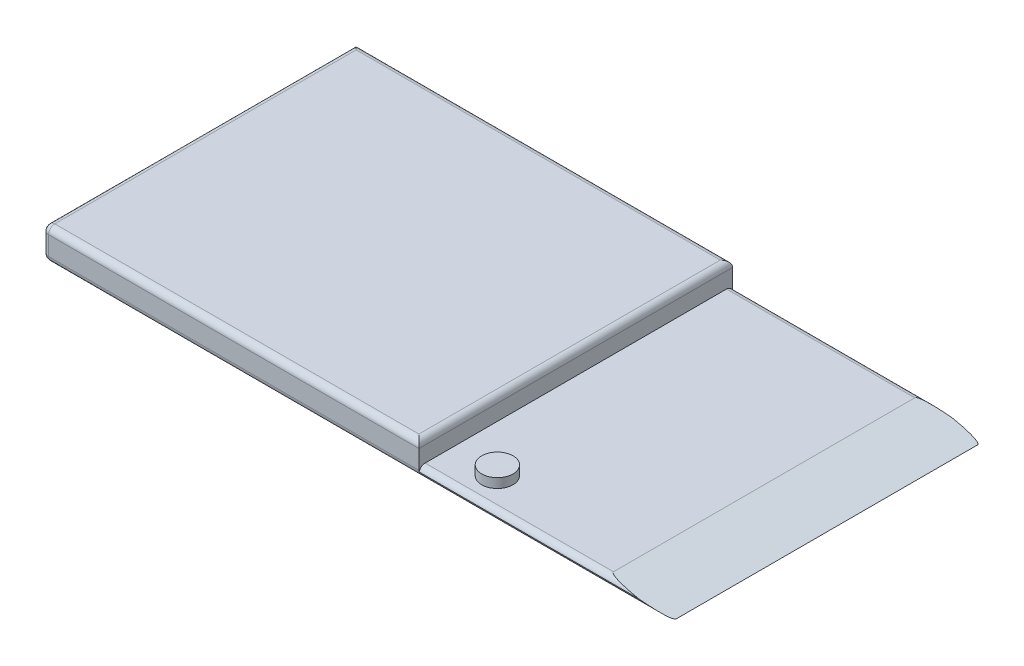
ISO-10303-21;
HEADER;
FILE_DESCRIPTION(('STEP AP214'),'2;1');
FILE_NAME('part.step','',(''),(''),'','','');
FILE_SCHEMA(('AUTOMOTIVE_DESIGN { 1 0 10303 214 1 1 1 1 }'));
ENDSEC;
DATA;
#1=APPLICATION_CONTEXT('core data for automotive mechanical design processes');
#2=APPLICATION_PROTOCOL_DEFINITION('international standard','automotive_design',2000,#1);
#3=PRODUCT_CONTEXT('',#1,'mechanical');
#4=PRODUCT('Part','Part','',(#3));
#5=PRODUCT_RELATED_PRODUCT_CATEGORY('part','',(#4));
#6=PRODUCT_DEFINITION_FORMATION('','',#4);
#7=PRODUCT_DEFINITION_CONTEXT('part definition',#1,'design');
#8=PRODUCT_DEFINITION('design','',#6,#7);
#9=PRODUCT_DEFINITION_SHAPE('','',#8);
#10=(LENGTH_UNIT() NAMED_UNIT(*) SI_UNIT(.MILLI.,.METRE.));
#11=(NAMED_UNIT(*) PLANE_ANGLE_UNIT() SI_UNIT($,.RADIAN.));
#12=(NAMED_UNIT(*) SI_UNIT($,.STERADIAN.) SOLID_ANGLE_UNIT());
#13=UNCERTAINTY_MEASURE_WITH_UNIT(LENGTH_MEASURE(1.E-05),#10,'distance_accuracy_value','');
#14=(GEOMETRIC_REPRESENTATION_CONTEXT(3) GLOBAL_UNCERTAINTY_ASSIGNED_CONTEXT((#13)) GLOBAL_UNIT_ASSIGNED_CONTEXT((#10,
#11,#12)) REPRESENTATION_CONTEXT('',''));
#15=CARTESIAN_POINT('',(0.,0.,0.));
#16=DIRECTION('',(0.,0.,1.));
#17=DIRECTION('',(1.,0.,0.));
#18=AXIS2_PLACEMENT_3D('',#15,#16,#17);
#19=CARTESIAN_POINT('',(-127.,12.7,-63.5));
#20=DIRECTION('',(0.,0.,1.));
#21=DIRECTION('',(1.,0.,0.));
#22=AXIS2_PLACEMENT_3D('',#19,#20,#21);
#23=PLANE('',#22);
#24=DIRECTION('',(0.,1.,0.));
#25=VECTOR('',#24,1.);
#26=CARTESIAN_POINT('',(25.4,12.7,-63.5));
#27=LINE('',#26,#25);
#28=CARTESIAN_POINT('',(25.4,2.54,-63.5));
#29=VERTEX_POINT('',#28);
#30=CARTESIAN_POINT('',(25.4,10.16,-63.5));
#31=VERTEX_POINT('',#30);
#32=EDGE_CURVE('E171',#29,#31,#27,.T.);
#33=ORIENTED_EDGE('',*,*,#32,.F.);
#34=DIRECTION('',(-1.,0.,0.));
#35=VECTOR('',#34,1.);
#36=CARTESIAN_POINT('',(-127.,2.54,-63.5));
#37=LINE('',#36,#35);
#38=CARTESIAN_POINT('',(-127.,2.54,-63.5));
#39=VERTEX_POINT('',#38);
#40=EDGE_CURVE('E279',#29,#39,#37,.T.);
#41=ORIENTED_EDGE('',*,*,#40,.T.);
#42=DIRECTION('',(0.,-1.,0.));
#43=VECTOR('',#42,1.);
#44=CARTESIAN_POINT('',(-127.,12.7,-63.5));
#45=LINE('',#44,#43);
#46=CARTESIAN_POINT('',(-127.,10.16,-63.5));
#47=VERTEX_POINT('',#46);
#48=EDGE_CURVE('E175',#47,#39,#45,.T.);
#49=ORIENTED_EDGE('',*,*,#48,.F.);
#50=DIRECTION('',(-1.,0.,0.));
#51=VECTOR('',#50,1.);
#52=CARTESIAN_POINT('',(25.4,10.16,-63.5));
#53=LINE('',#52,#51);
#54=EDGE_CURVE('E215',#47,#31,#53,.F.);
#55=ORIENTED_EDGE('',*,*,#54,.T.);
#56=EDGE_LOOP('',(#33,#41,#49,#55));
#57=FACE_BOUND('',#56,.T.);
#58=ADVANCED_FACE('F42',(#57),#23,.F.);
#59=CARTESIAN_POINT('',(-127.,12.7,63.5));
#60=DIRECTION('',(0.,0.,-1.));
#61=DIRECTION('',(-1.,0.,0.));
#62=AXIS2_PLACEMENT_3D('',#59,#60,#61);
#63=PLANE('',#62);
#64=DIRECTION('',(1.,0.,0.));
#65=VECTOR('',#64,1.);
#66=CARTESIAN_POINT('',(-127.,10.16,63.5));
#67=LINE('',#66,#65);
#68=CARTESIAN_POINT('',(25.4,10.16,63.5));
#69=VERTEX_POINT('',#68);
#70=CARTESIAN_POINT('',(-124.46,10.16,63.5));
#71=VERTEX_POINT('',#70);
#72=EDGE_CURVE('E155',#69,#71,#67,.F.);
#73=ORIENTED_EDGE('',*,*,#72,.T.);
#74=DIRECTION('',(0.,-1.,0.));
#75=VECTOR('',#74,1.);
#76=CARTESIAN_POINT('',(-124.46,12.7,63.5));
#77=LINE('',#76,#75);
#78=CARTESIAN_POINT('',(-124.46,2.54,63.5));
#79=VERTEX_POINT('',#78);
#80=EDGE_CURVE('E261',#71,#79,#77,.T.);
#81=ORIENTED_EDGE('',*,*,#80,.T.);
#82=DIRECTION('',(1.,0.,0.));
#83=VECTOR('',#82,1.);
#84=CARTESIAN_POINT('',(-127.,2.54,63.5));
#85=LINE('',#84,#83);
#86=CARTESIAN_POINT('',(25.4,2.54000000000001,63.5));
#87=VERTEX_POINT('',#86);
#88=EDGE_CURVE('E179',#79,#87,#85,.T.);
#89=ORIENTED_EDGE('',*,*,#88,.T.);
#90=DIRECTION('',(0.,1.,0.));
#91=VECTOR('',#90,1.);
#92=CARTESIAN_POINT('',(25.4,12.7,63.5));
#93=LINE('',#92,#91);
#94=EDGE_CURVE('E168',#87,#69,#93,.T.);
#95=ORIENTED_EDGE('',*,*,#94,.T.);
#96=EDGE_LOOP('',(#73,#81,#89,#95));
#97=FACE_BOUND('',#96,.T.);
#98=ADVANCED_FACE('F177',(#97),#63,.F.);
#99=CARTESIAN_POINT('',(0.,12.7,0.));
#100=DIRECTION('',(0.,1.,0.));
#101=DIRECTION('',(0.,0.,1.));
#102=AXIS2_PLACEMENT_3D('',#99,#100,#101);
#103=PLANE('',#102);
#104=DIRECTION('',(1.,0.,0.));
#105=VECTOR('',#104,1.);
#106=CARTESIAN_POINT('',(25.4,12.7,60.96));
#107=LINE('',#106,#105);
#108=CARTESIAN_POINT('',(-124.46,12.7,60.96));
#109=VERTEX_POINT('',#108);
#110=CARTESIAN_POINT('',(22.86,12.7,60.96));
#111=VERTEX_POINT('',#110);
#112=EDGE_CURVE('E174',#109,#111,#107,.T.);
#113=ORIENTED_EDGE('',*,*,#112,.T.);
#114=DIRECTION('',(0.,0.,1.));
#115=VECTOR('',#114,1.);
#116=CARTESIAN_POINT('',(22.86,12.7,0.));
#117=LINE('',#116,#115);
#118=CARTESIAN_POINT('',(22.86,12.7,-60.96));
#119=VERTEX_POINT('',#118);
#120=EDGE_CURVE('E146',#111,#119,#117,.F.);
#121=ORIENTED_EDGE('',*,*,#120,.T.);
#122=DIRECTION('',(-1.,0.,0.));
#123=VECTOR('',#122,1.);
#124=CARTESIAN_POINT('',(-127.,12.7,-60.96));
#125=LINE('',#124,#123);
#126=CARTESIAN_POINT('',(-124.46,12.7,-60.96));
#127=VERTEX_POINT('',#126);
#128=EDGE_CURVE('E210',#119,#127,#125,.T.);
#129=ORIENTED_EDGE('',*,*,#128,.T.);
#130=DIRECTION('',(0.,0.,1.));
#131=VECTOR('',#130,1.);
#132=CARTESIAN_POINT('',(-124.46,12.7,63.5));
#133=LINE('',#132,#131);
#134=EDGE_CURVE('E206',#127,#109,#133,.T.);
#135=ORIENTED_EDGE('',*,*,#134,.T.);
#136=EDGE_LOOP('',(#113,#121,#129,#135));
#137=FACE_BOUND('',#136,.T.);
#138=ADVANCED_FACE('F340',(#137),#103,.T.);
#139=CARTESIAN_POINT('',(-127.,12.7,-63.5));
#140=DIRECTION('',(1.,0.,0.));
#141=DIRECTION('',(0.,0.,-1.));
#142=AXIS2_PLACEMENT_3D('',#139,#140,#141);
#143=PLANE('',#142);
#144=DIRECTION('',(0.,0.,1.));
#145=VECTOR('',#144,1.);
#146=CARTESIAN_POINT('',(-127.,2.54,-63.5));
#147=LINE('',#146,#145);
#148=CARTESIAN_POINT('',(-127.,2.54,60.96));
#149=VERTEX_POINT('',#148);
#150=EDGE_CURVE('E264',#39,#149,#147,.T.);
#151=ORIENTED_EDGE('',*,*,#150,.T.);
#152=DIRECTION('',(0.,-1.,0.));
#153=VECTOR('',#152,1.);
#154=CARTESIAN_POINT('',(-127.,12.7,60.96));
#155=LINE('',#154,#153);
#156=CARTESIAN_POINT('',(-127.,10.16,60.96));
#157=VERTEX_POINT('',#156);
#158=EDGE_CURVE('E267',#149,#157,#155,.F.);
#159=ORIENTED_EDGE('',*,*,#158,.T.);
#160=DIRECTION('',(0.,0.,1.));
#161=VECTOR('',#160,1.);
#162=CARTESIAN_POINT('',(-127.,10.16,-63.5));
#163=LINE('',#162,#161);
#164=EDGE_CURVE('E163',#157,#47,#163,.F.);
#165=ORIENTED_EDGE('',*,*,#164,.T.);
#166=ORIENTED_EDGE('',*,*,#48,.T.);
#167=EDGE_LOOP('',(#151,#159,#165,#166));
#168=FACE_BOUND('',#167,.T.);
#169=ADVANCED_FACE('F352',(#168),#143,.F.);
#170=CARTESIAN_POINT('',(0.,0.,0.));
#171=DIRECTION('',(0.,1.,0.));
#172=DIRECTION('',(0.,0.,1.));
#173=AXIS2_PLACEMENT_3D('',#170,#171,#172);
#174=PLANE('',#173);
#175=DIRECTION('',(1.,0.,0.));
#176=VECTOR('',#175,1.);
#177=CARTESIAN_POINT('',(0.,0.,60.96));
#178=LINE('',#177,#176);
#179=CARTESIAN_POINT('',(127.,0.,60.96));
#180=VERTEX_POINT('',#179);
#181=CARTESIAN_POINT('',(-124.46,0.,60.96));
#182=VERTEX_POINT('',#181);
#183=EDGE_CURVE('E240',#180,#182,#178,.F.);
#184=ORIENTED_EDGE('',*,*,#183,.T.);
#185=DIRECTION('',(0.,0.,1.));
#186=VECTOR('',#185,1.);
#187=CARTESIAN_POINT('',(-124.46,0.,0.));
#188=LINE('',#187,#186);
#189=CARTESIAN_POINT('',(-124.46,0.,-60.96));
#190=VERTEX_POINT('',#189);
#191=EDGE_CURVE('E276',#182,#190,#188,.F.);
#192=ORIENTED_EDGE('',*,*,#191,.T.);
#193=DIRECTION('',(-1.,0.,0.));
#194=VECTOR('',#193,1.);
#195=CARTESIAN_POINT('',(0.,0.,-60.96));
#196=LINE('',#195,#194);
#197=CARTESIAN_POINT('',(127.,0.,-60.96));
#198=VERTEX_POINT('',#197);
#199=EDGE_CURVE('E273',#190,#198,#196,.F.);
#200=ORIENTED_EDGE('',*,*,#199,.T.);
#201=DIRECTION('',(0.,0.,-1.));
#202=VECTOR('',#201,1.);
#203=CARTESIAN_POINT('',(127.,0.,-63.5));
#204=LINE('',#203,#202);
#205=EDGE_CURVE('E195',#180,#198,#204,.T.);
#206=ORIENTED_EDGE('',*,*,#205,.F.);
#207=EDGE_LOOP('',(#184,#192,#200,#206));
#208=FACE_BOUND('',#207,.T.);
#209=ADVANCED_FACE('F313',(#208),#174,.F.);
#210=CARTESIAN_POINT('',(25.4,12.7,-63.5));
#211=DIRECTION('',(1.,0.,0.));
#212=DIRECTION('',(0.,1.,0.));
#213=AXIS2_PLACEMENT_3D('',#210,#211,#212);
#214=PLANE('',#213);
#215=CARTESIAN_POINT('',(25.4,1.27,-60.96));
#216=DIRECTION('',(1.,0.,0.));
#217=DIRECTION('',(0.,1.,0.));
#218=AXIS2_PLACEMENT_3D('',#215,#216,#217);
#219=CIRCLE('',#218,2.54);
#220=CARTESIAN_POINT('',(25.4,3.81,-60.96));
#221=VERTEX_POINT('',#220);
#222=CARTESIAN_POINT('',(25.4,1.905,-63.4193444248417));
#223=VERTEX_POINT('',#222);
#224=EDGE_CURVE('E244',#221,#223,#219,.F.);
#225=ORIENTED_EDGE('',*,*,#224,.T.);
#226=CARTESIAN_POINT('',(25.4,2.54,-60.96));
#227=DIRECTION('',(1.,0.,0.));
#228=DIRECTION('',(0.,1.,0.));
#229=AXIS2_PLACEMENT_3D('',#226,#227,#228);
#230=CIRCLE('',#229,2.54);
#231=EDGE_CURVE('E12',#223,#29,#230,.T.);
#232=ORIENTED_EDGE('',*,*,#231,.T.);
#233=ORIENTED_EDGE('',*,*,#32,.T.);
#234=DIRECTION('',(0.,0.,1.));
#235=VECTOR('',#234,1.);
#236=CARTESIAN_POINT('',(25.4,10.16,-63.5));
#237=LINE('',#236,#235);
#238=EDGE_CURVE('E144',#31,#69,#237,.T.);
#239=ORIENTED_EDGE('',*,*,#238,.T.);
#240=ORIENTED_EDGE('',*,*,#94,.F.);
#241=CARTESIAN_POINT('',(25.4,2.54,60.96));
#242=DIRECTION('',(1.,0.,0.));
#243=DIRECTION('',(0.,1.,0.));
#244=AXIS2_PLACEMENT_3D('',#241,#242,#243);
#245=CIRCLE('',#244,2.54);
#246=CARTESIAN_POINT('',(25.4,1.905,63.4193444248417));
#247=VERTEX_POINT('',#246);
#248=EDGE_CURVE('E250',#87,#247,#245,.T.);
#249=ORIENTED_EDGE('',*,*,#248,.T.);
#250=CARTESIAN_POINT('',(25.4,1.27,60.96));
#251=DIRECTION('',(1.,0.,0.));
#252=DIRECTION('',(0.,1.,0.));
#253=AXIS2_PLACEMENT_3D('',#250,#251,#252);
#254=CIRCLE('',#253,2.54);
#255=CARTESIAN_POINT('',(25.4,3.81,60.96));
#256=VERTEX_POINT('',#255);
#257=EDGE_CURVE('E247',#247,#256,#254,.F.);
#258=ORIENTED_EDGE('',*,*,#257,.T.);
#259=DIRECTION('',(0.,0.,1.));
#260=VECTOR('',#259,1.);
#261=CARTESIAN_POINT('',(25.4,3.81,-63.5));
#262=LINE('',#261,#260);
#263=EDGE_CURVE('E191',#221,#256,#262,.T.);
#264=ORIENTED_EDGE('',*,*,#263,.F.);
#265=EDGE_LOOP('',(#225,#232,#233,#239,#240,#249,#258,#264));
#266=FACE_BOUND('',#265,.T.);
#267=ADVANCED_FACE('F167',(#266),#214,.T.);
#268=CARTESIAN_POINT('',(25.4,3.81,-63.5));
#269=DIRECTION('',(0.,1.,0.));
#270=DIRECTION('',(0.,0.,1.));
#271=AXIS2_PLACEMENT_3D('',#268,#269,#270);
#272=PLANE('',#271);
#273=CARTESIAN_POINT('',(44.45,3.81,50.8));
#274=DIRECTION('',(0.,1.,0.));
#275=DIRECTION('',(0.,0.,1.));
#276=AXIS2_PLACEMENT_3D('',#273,#274,#275);
#277=CIRCLE('',#276,6.35);
#278=CARTESIAN_POINT('',(44.45,3.81,44.45));
#279=VERTEX_POINT('',#278);
#280=EDGE_CURVE('E540',#279,#279,#277,.T.);
#281=ORIENTED_EDGE('',*,*,#280,.F.);
#282=EDGE_LOOP('',(#281));
#283=FACE_BOUND('',#282,.T.);
#284=DIRECTION('',(0.,0.,1.));
#285=VECTOR('',#284,1.);
#286=CARTESIAN_POINT('',(101.6,3.81,-63.5));
#287=LINE('',#286,#285);
#288=CARTESIAN_POINT('',(101.6,3.81,-60.96));
#289=VERTEX_POINT('',#288);
#290=CARTESIAN_POINT('',(101.6,3.81,60.96));
#291=VERTEX_POINT('',#290);
#292=EDGE_CURVE('E185',#289,#291,#287,.T.);
#293=ORIENTED_EDGE('',*,*,#292,.F.);
#294=DIRECTION('',(-1.,0.,0.));
#295=VECTOR('',#294,1.);
#296=CARTESIAN_POINT('',(25.4,3.81,-60.96));
#297=LINE('',#296,#295);
#298=EDGE_CURVE('E225',#289,#221,#297,.T.);
#299=ORIENTED_EDGE('',*,*,#298,.T.);
#300=ORIENTED_EDGE('',*,*,#263,.T.);
#301=DIRECTION('',(-1.,0.,0.));
#302=VECTOR('',#301,1.);
#303=CARTESIAN_POINT('',(101.6,3.81,60.96));
#304=LINE('',#303,#302);
#305=EDGE_CURVE('E162',#256,#291,#304,.F.);
#306=ORIENTED_EDGE('',*,*,#305,.T.);
#307=EDGE_LOOP('',(#293,#299,#300,#306));
#308=FACE_BOUND('',#307,.T.);
#309=ADVANCED_FACE('F327',(#283,#308),#272,.T.);
#310=CARTESIAN_POINT('',(101.6,3.81,-63.5));
#311=DIRECTION('',(0.148340452930245,0.988936352868298,0.));
#312=DIRECTION('',(-0.988936352868298,0.148340452930245,0.));
#313=AXIS2_PLACEMENT_3D('',#310,#311,#312);
#314=PLANE('',#313);
#315=ORIENTED_EDGE('',*,*,#205,.T.);
#316=CARTESIAN_POINT('',(110.066666666667,2.54,-60.96));
#317=DIRECTION('',(0.148340452930245,0.988936352868298,0.));
#318=DIRECTION('',(-0.988936352868298,0.148340452930245,0.));
#319=AXIS2_PLACEMENT_3D('',#316,#317,#318);
#320=ELLIPSE('',#319,17.1227736590126,2.54);
#321=CARTESIAN_POINT('',(114.3,1.905,-63.4193444248417));
#322=VERTEX_POINT('',#321);
#323=EDGE_CURVE('E67',#198,#322,#320,.T.);
#324=ORIENTED_EDGE('',*,*,#323,.T.);
#325=CARTESIAN_POINT('',(118.533333333333,1.27,-60.96));
#326=DIRECTION('',(0.148340452930245,0.988936352868298,0.));
#327=DIRECTION('',(0.988936352868298,-0.148340452930245,0.));
#328=AXIS2_PLACEMENT_3D('',#325,#326,#327);
#329=ELLIPSE('',#328,17.1227736590126,2.54);
#330=EDGE_CURVE('E235',#322,#289,#329,.T.);
#331=ORIENTED_EDGE('',*,*,#330,.T.);
#332=ORIENTED_EDGE('',*,*,#292,.T.);
#333=CARTESIAN_POINT('',(118.533333333333,1.27,60.96));
#334=DIRECTION('',(0.148340452930245,0.988936352868298,0.));
#335=DIRECTION('',(0.988936352868298,-0.148340452930245,0.));
#336=AXIS2_PLACEMENT_3D('',#333,#334,#335);
#337=ELLIPSE('',#336,17.1227736590126,2.54);
#338=CARTESIAN_POINT('',(114.3,1.905,63.4193444248417));
#339=VERTEX_POINT('',#338);
#340=EDGE_CURVE('E232',#291,#339,#337,.T.);
#341=ORIENTED_EDGE('',*,*,#340,.T.);
#342=CARTESIAN_POINT('',(110.066666666667,2.54,60.96));
#343=DIRECTION('',(0.148340452930245,0.988936352868298,0.));
#344=DIRECTION('',(0.988936352868298,-0.148340452930245,0.));
#345=AXIS2_PLACEMENT_3D('',#342,#343,#344);
#346=ELLIPSE('',#345,17.1227736590126,2.54);
#347=EDGE_CURVE('E229',#339,#180,#346,.T.);
#348=ORIENTED_EDGE('',*,*,#347,.T.);
#349=EDGE_LOOP('',(#315,#324,#331,#332,#341,#348));
#350=FACE_BOUND('',#349,.T.);
#351=ADVANCED_FACE('F315',(#350),#314,.T.);
#352=CARTESIAN_POINT('',(-124.46,10.16,0.));
#353=DIRECTION('',(0.,0.,-1.));
#354=DIRECTION('',(-1.,0.,0.));
#355=AXIS2_PLACEMENT_3D('',#352,#353,#354);
#356=CYLINDRICAL_SURFACE('',#355,2.54);
#357=ORIENTED_EDGE('',*,*,#164,.F.);
#358=CARTESIAN_POINT('',(-124.46,10.16,60.96));
#359=DIRECTION('',(0.,0.,-1.));
#360=DIRECTION('',(-1.,0.,0.));
#361=AXIS2_PLACEMENT_3D('',#358,#359,#360);
#362=CIRCLE('',#361,2.54);
#363=EDGE_CURVE('E258',#157,#109,#362,.T.);
#364=ORIENTED_EDGE('',*,*,#363,.T.);
#365=ORIENTED_EDGE('',*,*,#134,.F.);
#366=CARTESIAN_POINT('',(-124.46,10.16,-60.96));
#367=DIRECTION('',(0.707106781186547,0.,-0.707106781186548));
#368=DIRECTION('',(-0.707106781186548,0.,-0.707106781186547));
#369=AXIS2_PLACEMENT_3D('',#366,#367,#368);
#370=ELLIPSE('',#369,3.59210244842766,2.54);
#371=EDGE_CURVE('E181',#47,#127,#370,.T.);
#372=ORIENTED_EDGE('',*,*,#371,.F.);
#373=EDGE_LOOP('',(#357,#364,#365,#372));
#374=FACE_BOUND('',#373,.T.);
#375=ADVANCED_FACE('F354',(#374),#356,.T.);
#376=CARTESIAN_POINT('',(0.,10.16,-60.96));
#377=DIRECTION('',(1.,0.,0.));
#378=DIRECTION('',(0.,0.,-1.));
#379=AXIS2_PLACEMENT_3D('',#376,#377,#378);
#380=CYLINDRICAL_SURFACE('',#379,2.54);
#381=ORIENTED_EDGE('',*,*,#371,.T.);
#382=ORIENTED_EDGE('',*,*,#128,.F.);
#383=CARTESIAN_POINT('',(22.86,10.16,-60.96));
#384=DIRECTION('',(0.707106781186547,0.,0.707106781186547));
#385=DIRECTION('',(0.707106781186547,0.,-0.707106781186547));
#386=AXIS2_PLACEMENT_3D('',#383,#384,#385);
#387=ELLIPSE('',#386,3.59210244842766,2.54);
#388=EDGE_CURVE('E150',#31,#119,#387,.T.);
#389=ORIENTED_EDGE('',*,*,#388,.F.);
#390=ORIENTED_EDGE('',*,*,#54,.F.);
#391=EDGE_LOOP('',(#381,#382,#389,#390));
#392=FACE_BOUND('',#391,.T.);
#393=ADVANCED_FACE('F337',(#392),#380,.T.);
#394=CARTESIAN_POINT('',(0.,10.16,60.96));
#395=DIRECTION('',(-1.,0.,0.));
#396=DIRECTION('',(0.,0.,1.));
#397=AXIS2_PLACEMENT_3D('',#394,#395,#396);
#398=CYLINDRICAL_SURFACE('',#397,2.54);
#399=ORIENTED_EDGE('',*,*,#112,.F.);
#400=CARTESIAN_POINT('',(-124.46,10.16,60.96));
#401=DIRECTION('',(-1.,0.,0.));
#402=DIRECTION('',(0.,0.,1.));
#403=AXIS2_PLACEMENT_3D('',#400,#401,#402);
#404=CIRCLE('',#403,2.54);
#405=EDGE_CURVE('E158',#109,#71,#404,.F.);
#406=ORIENTED_EDGE('',*,*,#405,.T.);
#407=ORIENTED_EDGE('',*,*,#72,.F.);
#408=CARTESIAN_POINT('',(22.86,10.16,60.96));
#409=DIRECTION('',(-0.707106781186547,0.,0.707106781186547));
#410=DIRECTION('',(-0.707106781186547,0.,-0.707106781186547));
#411=AXIS2_PLACEMENT_3D('',#408,#409,#410);
#412=ELLIPSE('',#411,3.59210244842766,2.54);
#413=EDGE_CURVE('E140',#111,#69,#412,.F.);
#414=ORIENTED_EDGE('',*,*,#413,.F.);
#415=EDGE_LOOP('',(#399,#406,#407,#414));
#416=FACE_BOUND('',#415,.T.);
#417=ADVANCED_FACE('F156',(#416),#398,.T.);
#418=CARTESIAN_POINT('',(22.86,10.16,-63.5));
#419=DIRECTION('',(0.,0.,1.));
#420=DIRECTION('',(1.,0.,0.));
#421=AXIS2_PLACEMENT_3D('',#418,#419,#420);
#422=CYLINDRICAL_SURFACE('',#421,2.54);
#423=ORIENTED_EDGE('',*,*,#388,.T.);
#424=ORIENTED_EDGE('',*,*,#120,.F.);
#425=ORIENTED_EDGE('',*,*,#413,.T.);
#426=ORIENTED_EDGE('',*,*,#238,.F.);
#427=EDGE_LOOP('',(#423,#424,#425,#426));
#428=FACE_BOUND('',#427,.T.);
#429=ADVANCED_FACE('F142',(#428),#422,.T.);
#430=CARTESIAN_POINT('',(25.4,1.27,-60.96));
#431=DIRECTION('',(1.,0.,0.));
#432=DIRECTION('',(0.,0.,-1.));
#433=AXIS2_PLACEMENT_3D('',#430,#431,#432);
#434=CYLINDRICAL_SURFACE('',#433,2.54);
#435=ORIENTED_EDGE('',*,*,#330,.F.);
#436=DIRECTION('',(-1.,0.,0.));
#437=VECTOR('',#436,1.);
#438=CARTESIAN_POINT('',(114.3,1.905,-63.4193444248417));
#439=LINE('',#438,#437);
#440=EDGE_CURVE('E52',#322,#223,#439,.T.);
#441=ORIENTED_EDGE('',*,*,#440,.T.);
#442=ORIENTED_EDGE('',*,*,#224,.F.);
#443=ORIENTED_EDGE('',*,*,#298,.F.);
#444=EDGE_LOOP('',(#435,#441,#442,#443));
#445=FACE_BOUND('',#444,.T.);
#446=ADVANCED_FACE('F329',(#445),#434,.T.);
#447=CARTESIAN_POINT('',(-127.,2.54,60.96));
#448=DIRECTION('',(1.,0.,0.));
#449=DIRECTION('',(0.,0.,-1.));
#450=AXIS2_PLACEMENT_3D('',#447,#448,#449);
#451=CYLINDRICAL_SURFACE('',#450,2.54);
#452=ORIENTED_EDGE('',*,*,#88,.F.);
#453=CARTESIAN_POINT('',(-124.46,2.54,60.96));
#454=DIRECTION('',(1.,0.,0.));
#455=DIRECTION('',(0.,0.,-1.));
#456=AXIS2_PLACEMENT_3D('',#453,#454,#455);
#457=CIRCLE('',#456,2.54);
#458=EDGE_CURVE('E270',#79,#182,#457,.T.);
#459=ORIENTED_EDGE('',*,*,#458,.T.);
#460=ORIENTED_EDGE('',*,*,#183,.F.);
#461=ORIENTED_EDGE('',*,*,#347,.F.);
#462=DIRECTION('',(1.,0.,0.));
#463=VECTOR('',#462,1.);
#464=CARTESIAN_POINT('',(25.4,1.905,63.4193444248417));
#465=LINE('',#464,#463);
#466=EDGE_CURVE('E151',#247,#339,#465,.T.);
#467=ORIENTED_EDGE('',*,*,#466,.F.);
#468=ORIENTED_EDGE('',*,*,#248,.F.);
#469=EDGE_LOOP('',(#452,#459,#460,#461,#467,#468));
#470=FACE_BOUND('',#469,.T.);
#471=ADVANCED_FACE('F319',(#470),#451,.T.);
#472=CARTESIAN_POINT('',(-127.,1.27,60.96));
#473=DIRECTION('',(1.,0.,0.));
#474=DIRECTION('',(0.,0.,-1.));
#475=AXIS2_PLACEMENT_3D('',#472,#473,#474);
#476=CYLINDRICAL_SURFACE('',#475,2.54);
#477=ORIENTED_EDGE('',*,*,#340,.F.);
#478=ORIENTED_EDGE('',*,*,#305,.F.);
#479=ORIENTED_EDGE('',*,*,#257,.F.);
#480=ORIENTED_EDGE('',*,*,#466,.T.);
#481=EDGE_LOOP('',(#477,#478,#479,#480));
#482=FACE_BOUND('',#481,.T.);
#483=ADVANCED_FACE('F322',(#482),#476,.T.);
#484=CARTESIAN_POINT('',(-127.,2.54,-60.96));
#485=DIRECTION('',(-1.,0.,0.));
#486=DIRECTION('',(0.,0.,1.));
#487=AXIS2_PLACEMENT_3D('',#484,#485,#486);
#488=CYLINDRICAL_SURFACE('',#487,2.54);
#489=ORIENTED_EDGE('',*,*,#323,.F.);
#490=ORIENTED_EDGE('',*,*,#199,.F.);
#491=CARTESIAN_POINT('',(-124.46,2.54,-60.96));
#492=DIRECTION('',(-0.707106781186547,0.,0.707106781186548));
#493=DIRECTION('',(-0.707106781186548,0.,-0.707106781186547));
#494=AXIS2_PLACEMENT_3D('',#491,#492,#493);
#495=ELLIPSE('',#494,3.59210244842766,2.54);
#496=EDGE_CURVE('E46',#39,#190,#495,.T.);
#497=ORIENTED_EDGE('',*,*,#496,.F.);
#498=ORIENTED_EDGE('',*,*,#40,.F.);
#499=ORIENTED_EDGE('',*,*,#231,.F.);
#500=ORIENTED_EDGE('',*,*,#440,.F.);
#501=EDGE_LOOP('',(#489,#490,#497,#498,#499,#500));
#502=FACE_BOUND('',#501,.T.);
#503=ADVANCED_FACE('F44',(#502),#488,.T.);
#504=CARTESIAN_POINT('',(-124.46,2.54,-63.5));
#505=DIRECTION('',(0.,0.,1.));
#506=DIRECTION('',(1.,0.,0.));
#507=AXIS2_PLACEMENT_3D('',#504,#505,#506);
#508=CYLINDRICAL_SURFACE('',#507,2.54);
#509=ORIENTED_EDGE('',*,*,#496,.T.);
#510=ORIENTED_EDGE('',*,*,#191,.F.);
#511=CARTESIAN_POINT('',(-124.46,2.54,60.96));
#512=DIRECTION('',(0.,0.,1.));
#513=DIRECTION('',(1.,0.,0.));
#514=AXIS2_PLACEMENT_3D('',#511,#512,#513);
#515=CIRCLE('',#514,2.54);
#516=EDGE_CURVE('E293',#149,#182,#515,.T.);
#517=ORIENTED_EDGE('',*,*,#516,.F.);
#518=ORIENTED_EDGE('',*,*,#150,.F.);
#519=EDGE_LOOP('',(#509,#510,#517,#518));
#520=FACE_BOUND('',#519,.T.);
#521=ADVANCED_FACE('F306',(#520),#508,.T.);
#522=CARTESIAN_POINT('',(-124.46,2.54,60.96));
#523=DIRECTION('',(1.,0.,0.));
#524=DIRECTION('',(0.,0.,-1.));
#525=AXIS2_PLACEMENT_3D('',#522,#523,#524);
#526=SPHERICAL_SURFACE('',#525,2.54);
#527=ORIENTED_EDGE('',*,*,#516,.T.);
#528=ORIENTED_EDGE('',*,*,#458,.F.);
#529=CARTESIAN_POINT('',(-124.46,2.54,60.96));
#530=DIRECTION('',(0.,1.,0.));
#531=DIRECTION('',(0.,0.,1.));
#532=AXIS2_PLACEMENT_3D('',#529,#530,#531);
#533=CIRCLE('',#532,2.54);
#534=EDGE_CURVE('E289',#149,#79,#533,.T.);
#535=ORIENTED_EDGE('',*,*,#534,.F.);
#536=EDGE_LOOP('',(#527,#528,#535));
#537=FACE_BOUND('',#536,.T.);
#538=ADVANCED_FACE('F349',(#537),#526,.T.);
#539=CARTESIAN_POINT('',(-124.46,12.7,60.96));
#540=DIRECTION('',(0.,-1.,0.));
#541=DIRECTION('',(0.,0.,-1.));
#542=AXIS2_PLACEMENT_3D('',#539,#540,#541);
#543=CYLINDRICAL_SURFACE('',#542,2.54);
#544=ORIENTED_EDGE('',*,*,#534,.T.);
#545=ORIENTED_EDGE('',*,*,#80,.F.);
#546=CARTESIAN_POINT('',(-124.46,10.16,60.96));
#547=DIRECTION('',(0.,1.,0.));
#548=DIRECTION('',(0.,0.,1.));
#549=AXIS2_PLACEMENT_3D('',#546,#547,#548);
#550=CIRCLE('',#549,2.54);
#551=EDGE_CURVE('E286',#157,#71,#550,.T.);
#552=ORIENTED_EDGE('',*,*,#551,.F.);
#553=ORIENTED_EDGE('',*,*,#158,.F.);
#554=EDGE_LOOP('',(#544,#545,#552,#553));
#555=FACE_BOUND('',#554,.T.);
#556=ADVANCED_FACE('F348',(#555),#543,.T.);
#557=CARTESIAN_POINT('',(-124.46,10.16,60.96));
#558=DIRECTION('',(0.,0.,1.));
#559=DIRECTION('',(1.,0.,0.));
#560=AXIS2_PLACEMENT_3D('',#557,#558,#559);
#561=SPHERICAL_SURFACE('',#560,2.54);
#562=ORIENTED_EDGE('',*,*,#405,.F.);
#563=ORIENTED_EDGE('',*,*,#363,.F.);
#564=ORIENTED_EDGE('',*,*,#551,.T.);
#565=EDGE_LOOP('',(#562,#563,#564));
#566=FACE_BOUND('',#565,.T.);
#567=ADVANCED_FACE('F343',(#566),#561,.T.);
#568=CARTESIAN_POINT('',(44.45,7.62,50.8));
#569=DIRECTION('',(0.,-1.,0.));
#570=DIRECTION('',(0.,0.,-1.));
#571=AXIS2_PLACEMENT_3D('',#568,#569,#570);
#572=CYLINDRICAL_SURFACE('',#571,6.35);
#573=CARTESIAN_POINT('',(44.45,7.62,50.8));
#574=DIRECTION('',(0.,1.,0.));
#575=DIRECTION('',(0.,0.,1.));
#576=AXIS2_PLACEMENT_3D('',#573,#574,#575);
#577=CIRCLE('',#576,6.35);
#578=CARTESIAN_POINT('',(44.45,7.62,44.45));
#579=VERTEX_POINT('',#578);
#580=EDGE_CURVE('E290',#579,#579,#577,.T.);
#581=CARTESIAN_POINT('',(44.45,7.62,44.45));
#582=CARTESIAN_POINT('',(44.45,7.5803125,44.45));
#583=CARTESIAN_POINT('',(44.45,7.540625,44.45));
#584=CARTESIAN_POINT('',(44.45,7.46125,44.45));
#585=CARTESIAN_POINT('',(44.45,7.4215625,44.45));
#586=CARTESIAN_POINT('',(44.45,7.3421875,44.45));
#587=CARTESIAN_POINT('',(44.45,7.3025,44.45));
#588=CARTESIAN_POINT('',(44.45,7.223125,44.45));
#589=CARTESIAN_POINT('',(44.45,7.1834375,44.45));
#590=CARTESIAN_POINT('',(44.45,7.1040625,44.45));
#591=CARTESIAN_POINT('',(44.45,7.064375,44.45));
#592=CARTESIAN_POINT('',(44.45,6.985,44.45));
#593=CARTESIAN_POINT('',(44.45,6.9453125,44.45));
#594=CARTESIAN_POINT('',(44.45,6.8659375,44.45));
#595=CARTESIAN_POINT('',(44.45,6.82625,44.45));
#596=CARTESIAN_POINT('',(44.45,6.746875,44.45));
#597=CARTESIAN_POINT('',(44.45,6.7071875,44.45));
#598=CARTESIAN_POINT('',(44.45,6.6278125,44.45));
#599=CARTESIAN_POINT('',(44.45,6.588125,44.45));
#600=CARTESIAN_POINT('',(44.45,6.50875,44.45));
#601=CARTESIAN_POINT('',(44.45,6.4690625,44.45));
#602=CARTESIAN_POINT('',(44.45,6.3896875,44.45));
#603=CARTESIAN_POINT('',(44.45,6.35,44.45));
#604=CARTESIAN_POINT('',(44.45,6.270625,44.45));
#605=CARTESIAN_POINT('',(44.45,6.2309375,44.45));
#606=CARTESIAN_POINT('',(44.45,6.1515625,44.45));
#607=CARTESIAN_POINT('',(44.45,6.111875,44.45));
#608=CARTESIAN_POINT('',(44.45,6.0325,44.45));
#609=CARTESIAN_POINT('',(44.45,5.9928125,44.45));
#610=CARTESIAN_POINT('',(44.45,5.9134375,44.45));
#611=CARTESIAN_POINT('',(44.45,5.87375,44.45));
#612=CARTESIAN_POINT('',(44.45,5.794375,44.45));
#613=CARTESIAN_POINT('',(44.45,5.7546875,44.45));
#614=CARTESIAN_POINT('',(44.45,5.6753125,44.45));
#615=CARTESIAN_POINT('',(44.45,5.635625,44.45));
#616=CARTESIAN_POINT('',(44.45,5.55625,44.45));
#617=CARTESIAN_POINT('',(44.45,5.5165625,44.45));
#618=CARTESIAN_POINT('',(44.45,5.4371875,44.45));
#619=CARTESIAN_POINT('',(44.45,5.3975,44.45));
#620=CARTESIAN_POINT('',(44.45,5.318125,44.45));
#621=CARTESIAN_POINT('',(44.45,5.2784375,44.45));
#622=CARTESIAN_POINT('',(44.45,5.1990625,44.45));
#623=CARTESIAN_POINT('',(44.45,5.159375,44.45));
#624=CARTESIAN_POINT('',(44.45,5.08,44.45));
#625=CARTESIAN_POINT('',(44.45,5.0403125,44.45));
#626=CARTESIAN_POINT('',(44.45,4.9609375,44.45));
#627=CARTESIAN_POINT('',(44.45,4.92125,44.45));
#628=CARTESIAN_POINT('',(44.45,4.841875,44.45));
#629=CARTESIAN_POINT('',(44.45,4.8021875,44.45));
#630=CARTESIAN_POINT('',(44.45,4.7228125,44.45));
#631=CARTESIAN_POINT('',(44.45,4.683125,44.45));
#632=CARTESIAN_POINT('',(44.45,4.60375,44.45));
#633=CARTESIAN_POINT('',(44.45,4.5640625,44.45));
#634=CARTESIAN_POINT('',(44.45,4.4846875,44.45));
#635=CARTESIAN_POINT('',(44.45,4.445,44.45));
#636=CARTESIAN_POINT('',(44.45,4.365625,44.45));
#637=CARTESIAN_POINT('',(44.45,4.3259375,44.45));
#638=CARTESIAN_POINT('',(44.45,4.2465625,44.45));
#639=CARTESIAN_POINT('',(44.45,4.206875,44.45));
#640=CARTESIAN_POINT('',(44.45,4.1275,44.45));
#641=CARTESIAN_POINT('',(44.45,4.0878125,44.45));
#642=CARTESIAN_POINT('',(44.45,4.0084375,44.45));
#643=CARTESIAN_POINT('',(44.45,3.96875,44.45));
#644=CARTESIAN_POINT('',(44.45,3.889375,44.45));
#645=CARTESIAN_POINT('',(44.45,3.8496875,44.45));
#646=CARTESIAN_POINT('',(44.45,3.81,44.45));
#647=B_SPLINE_CURVE_WITH_KNOTS('',3,(#581,#582,#583,#584,#585,#586,#587,#588,#589,#590,#591,
#592,#593,#594,#595,#596,#597,#598,#599,#600,#601,#602,#603,#604,#605,#606,#607,#608,#609,#610,
#611,#612,#613,#614,#615,#616,#617,#618,#619,#620,#621,#622,#623,#624,#625,#626,#627,#628,#629,
#630,#631,#632,#633,#634,#635,#636,#637,#638,#639,#640,#641,#642,#643,#644,#645,#646),
.UNSPECIFIED.,.F.,.F.,(4,2,2,2,2,2,2,2,2,2,2,2,2,2,2,2,2,2,2,2,2,2,2,2,2,2,2,2,2,2,2,2,4),(0.,
0.119062499999999,0.238125,0.3571875,0.476249999999999,0.595312499999999,0.714375,
0.833437499999999,0.952499999999999,1.0715625,1.190625,1.3096875,1.42875,1.5478125,1.666875,
1.7859375,1.905,2.0240625,2.143125,2.2621875,2.38125,2.5003125,2.619375,2.7384375,2.8575,
2.9765625,3.095625,3.2146875,3.33375,3.4528125,3.571875,3.6909375,3.81),.UNSPECIFIED.);
#648=EDGE_CURVE('BSEAM428',#579,#279,#647,.T.);
#649=ORIENTED_EDGE('',*,*,#580,.F.);
#650=ORIENTED_EDGE('',*,*,#280,.T.);
#651=ORIENTED_EDGE('',*,*,#648,.T.);
#652=ORIENTED_EDGE('',*,*,#648,.F.);
#653=EDGE_LOOP('',(#649,#651,#650,#652));
#654=FACE_BOUND('',#653,.T.);
#655=ADVANCED_FACE('F428',(#654),#572,.T.);
#656=CARTESIAN_POINT('',(44.45,7.62,50.8));
#657=DIRECTION('',(0.,1.,0.));
#658=DIRECTION('',(0.,0.,1.));
#659=AXIS2_PLACEMENT_3D('',#656,#657,#658);
#660=PLANE('',#659);
#661=ORIENTED_EDGE('',*,*,#580,.T.);
#662=EDGE_LOOP('',(#661));
#663=FACE_BOUND('',#662,.T.);
#664=ADVANCED_FACE('F436',(#663),#660,.T.);
#665=CLOSED_SHELL('',(#58,#98,#138,#169,#209,#267,#309,#351,#375,#393,#417,#429,#446,#471,#483,
#503,#521,#538,#556,#567,#655,#664));
#666=MANIFOLD_SOLID_BREP('B2',#665);
#667=ADVANCED_BREP_SHAPE_REPRESENTATION('',(#18,#666),#14);
#668=SHAPE_DEFINITION_REPRESENTATION(#9,#667);
ENDSEC;
END-ISO-10303-21;
